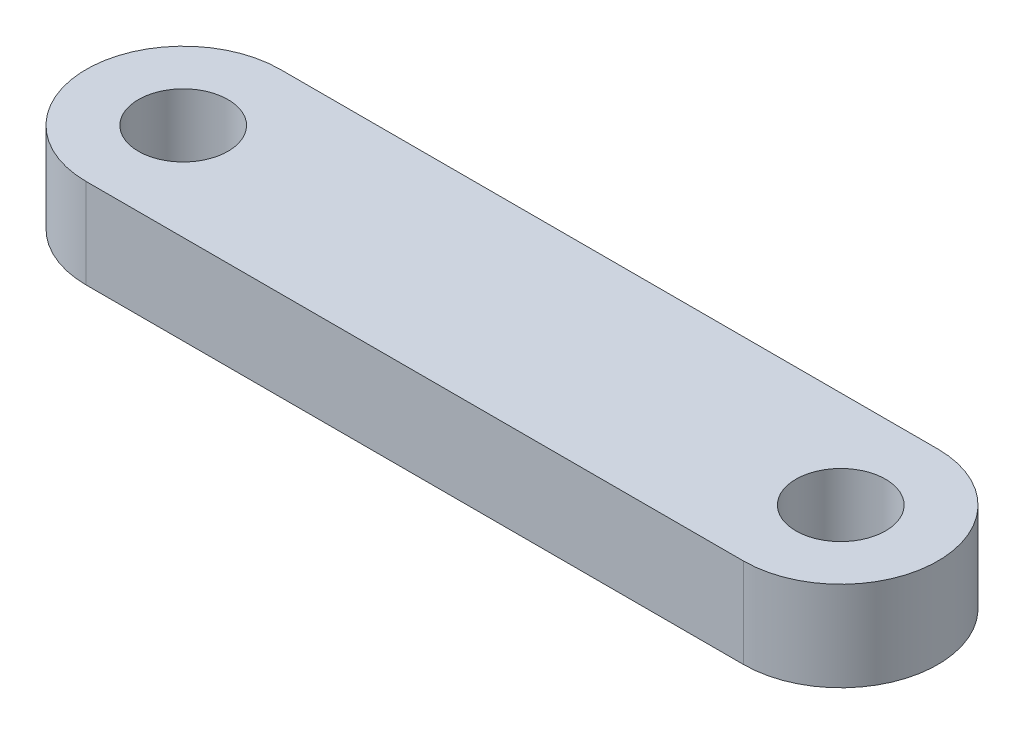
ISO-10303-21;
HEADER;
FILE_DESCRIPTION(('STEP AP214'),'2;1');
FILE_NAME('part.step','',(''),(''),'','','');
FILE_SCHEMA(('AUTOMOTIVE_DESIGN { 1 0 10303 214 1 1 1 1 }'));
ENDSEC;
DATA;
#1=APPLICATION_CONTEXT('core data for automotive mechanical design processes');
#2=APPLICATION_PROTOCOL_DEFINITION('international standard','automotive_design',2000,#1);
#3=PRODUCT_CONTEXT('',#1,'mechanical');
#4=PRODUCT('Part','Part','',(#3));
#5=PRODUCT_RELATED_PRODUCT_CATEGORY('part','',(#4));
#6=PRODUCT_DEFINITION_FORMATION('','',#4);
#7=PRODUCT_DEFINITION_CONTEXT('part definition',#1,'design');
#8=PRODUCT_DEFINITION('design','',#6,#7);
#9=PRODUCT_DEFINITION_SHAPE('','',#8);
#10=(LENGTH_UNIT() NAMED_UNIT(*) SI_UNIT(.MILLI.,.METRE.));
#11=(NAMED_UNIT(*) PLANE_ANGLE_UNIT() SI_UNIT($,.RADIAN.));
#12=(NAMED_UNIT(*) SI_UNIT($,.STERADIAN.) SOLID_ANGLE_UNIT());
#13=UNCERTAINTY_MEASURE_WITH_UNIT(LENGTH_MEASURE(1.E-05),#10,'distance_accuracy_value','');
#14=(GEOMETRIC_REPRESENTATION_CONTEXT(3) GLOBAL_UNCERTAINTY_ASSIGNED_CONTEXT((#13)) GLOBAL_UNIT_ASSIGNED_CONTEXT((#10,
#11,#12)) REPRESENTATION_CONTEXT('',''));
#15=CARTESIAN_POINT('',(0.,0.,0.));
#16=DIRECTION('',(0.,0.,1.));
#17=DIRECTION('',(1.,0.,0.));
#18=AXIS2_PLACEMENT_3D('',#15,#16,#17);
#19=CARTESIAN_POINT('',(-0.00681255714562196,3.,-136.973609565496));
#20=DIRECTION('',(4.97362751759736E-05,0.,0.999999998763151));
#21=DIRECTION('',(0.999999998763152,0.,-4.97362751759736E-05));
#22=AXIS2_PLACEMENT_3D('',#19,#20,#21);
#23=PLANE('',#22);
#24=DIRECTION('',(-0.999999998763152,0.,4.97362751759736E-05));
#25=VECTOR('',#24,1.);
#26=CARTESIAN_POINT('',(-0.00681255714562196,0.,-136.973609565496));
#27=LINE('',#26,#25);
#28=CARTESIAN_POINT('',(221.29931162483,0.,-136.984616507798));
#29=VERTEX_POINT('',#28);
#30=CARTESIAN_POINT('',(199.29931162483,0.,-136.983522309744));
#31=VERTEX_POINT('',#30);
#32=EDGE_CURVE('E105',#29,#31,#27,.T.);
#33=ORIENTED_EDGE('',*,*,#32,.T.);
#34=DIRECTION('',(0.,-1.,0.));
#35=VECTOR('',#34,1.);
#36=CARTESIAN_POINT('',(199.29931162483,3.,-136.983522309744));
#37=LINE('',#36,#35);
#38=CARTESIAN_POINT('',(199.29931162483,3.,-136.983522309744));
#39=VERTEX_POINT('',#38);
#40=EDGE_CURVE('E11',#39,#31,#37,.T.);
#41=ORIENTED_EDGE('',*,*,#40,.F.);
#42=DIRECTION('',(-0.999999998763152,0.,4.97362751759736E-05));
#43=VECTOR('',#42,1.);
#44=CARTESIAN_POINT('',(-0.00681255714562196,3.,-136.973609565496));
#45=LINE('',#44,#43);
#46=CARTESIAN_POINT('',(221.29931162483,3.,-136.984616507798));
#47=VERTEX_POINT('',#46);
#48=EDGE_CURVE('E87',#47,#39,#45,.T.);
#49=ORIENTED_EDGE('',*,*,#48,.F.);
#50=DIRECTION('',(0.,-1.,0.));
#51=VECTOR('',#50,1.);
#52=CARTESIAN_POINT('',(221.29931162483,3.,-136.984616507798));
#53=LINE('',#52,#51);
#54=EDGE_CURVE('E95',#47,#29,#53,.T.);
#55=ORIENTED_EDGE('',*,*,#54,.T.);
#56=EDGE_LOOP('',(#33,#41,#49,#55));
#57=FACE_BOUND('',#56,.T.);
#58=ADVANCED_FACE('F35',(#57),#23,.F.);
#59=CARTESIAN_POINT('',(199.29939413188,3.,-133.735744618646));
#60=DIRECTION('',(0.,-1.,0.));
#61=DIRECTION('',(0.,0.,-1.));
#62=AXIS2_PLACEMENT_3D('',#59,#60,#61);
#63=CYLINDRICAL_SURFACE('',#62,3.24777769214611);
#64=CARTESIAN_POINT('',(199.29939413188,0.,-133.735744618646));
#65=DIRECTION('',(0.,1.,0.));
#66=DIRECTION('',(0.,0.,1.));
#67=AXIS2_PLACEMENT_3D('',#64,#65,#66);
#68=CIRCLE('',#67,3.24777769214611);
#69=CARTESIAN_POINT('',(199.29931162483,0.,-130.487966927548));
#70=VERTEX_POINT('',#69);
#71=EDGE_CURVE('E91',#31,#70,#68,.T.);
#72=ORIENTED_EDGE('',*,*,#71,.T.);
#73=DIRECTION('',(0.,-1.,0.));
#74=VECTOR('',#73,1.);
#75=CARTESIAN_POINT('',(199.29931162483,3.,-130.487966927548));
#76=LINE('',#75,#74);
#77=CARTESIAN_POINT('',(199.29931162483,3.,-130.487966927548));
#78=VERTEX_POINT('',#77);
#79=EDGE_CURVE('E44',#78,#70,#76,.T.);
#80=ORIENTED_EDGE('',*,*,#79,.F.);
#81=CARTESIAN_POINT('',(199.29939413188,3.,-133.735744618646));
#82=DIRECTION('',(0.,1.,0.));
#83=DIRECTION('',(0.,0.,1.));
#84=AXIS2_PLACEMENT_3D('',#81,#82,#83);
#85=CIRCLE('',#84,3.24777769214611);
#86=EDGE_CURVE('E82',#39,#78,#85,.T.);
#87=ORIENTED_EDGE('',*,*,#86,.F.);
#88=ORIENTED_EDGE('',*,*,#40,.T.);
#89=EDGE_LOOP('',(#72,#80,#87,#88));
#90=FACE_BOUND('',#89,.T.);
#91=ADVANCED_FACE('F90',(#90),#63,.T.);
#92=CARTESIAN_POINT('',(-2.53661661056377E-12,3.,-130.487966927544));
#93=DIRECTION('',(0.,0.,-1.));
#94=DIRECTION('',(-1.,0.,0.));
#95=AXIS2_PLACEMENT_3D('',#92,#93,#94);
#96=PLANE('',#95);
#97=DIRECTION('',(1.,0.,0.));
#98=VECTOR('',#97,1.);
#99=CARTESIAN_POINT('',(-2.53661661056377E-12,0.,-130.487966927544));
#100=LINE('',#99,#98);
#101=CARTESIAN_POINT('',(221.29931162483,0.,-130.487966927548));
#102=VERTEX_POINT('',#101);
#103=EDGE_CURVE('E69',#70,#102,#100,.T.);
#104=ORIENTED_EDGE('',*,*,#103,.T.);
#105=DIRECTION('',(0.,-1.,0.));
#106=VECTOR('',#105,1.);
#107=CARTESIAN_POINT('',(221.29931162483,3.,-130.487966927548));
#108=LINE('',#107,#106);
#109=CARTESIAN_POINT('',(221.29931162483,3.,-130.487966927548));
#110=VERTEX_POINT('',#109);
#111=EDGE_CURVE('E92',#110,#102,#108,.T.);
#112=ORIENTED_EDGE('',*,*,#111,.F.);
#113=DIRECTION('',(1.,0.,0.));
#114=VECTOR('',#113,1.);
#115=CARTESIAN_POINT('',(-2.53661661056377E-12,3.,-130.487966927544));
#116=LINE('',#115,#114);
#117=EDGE_CURVE('E85',#78,#110,#116,.T.);
#118=ORIENTED_EDGE('',*,*,#117,.F.);
#119=ORIENTED_EDGE('',*,*,#79,.T.);
#120=EDGE_LOOP('',(#104,#112,#118,#119));
#121=FACE_BOUND('',#120,.T.);
#122=ADVANCED_FACE('F93',(#121),#96,.F.);
#123=CARTESIAN_POINT('',(199.29931162483,3.,-133.735744618646));
#124=DIRECTION('',(0.,-1.,0.));
#125=DIRECTION('',(0.,0.,-1.));
#126=AXIS2_PLACEMENT_3D('',#123,#124,#125);
#127=CYLINDRICAL_SURFACE('',#126,1.5);
#128=CARTESIAN_POINT('',(199.29931162483,3.,-133.735744618646));
#129=DIRECTION('',(0.,1.,0.));
#130=DIRECTION('',(0.,0.,1.));
#131=AXIS2_PLACEMENT_3D('',#128,#129,#130);
#132=CIRCLE('',#131,1.5);
#133=CARTESIAN_POINT('',(199.29931162483,3.,-132.235744618646));
#134=VERTEX_POINT('',#133);
#135=EDGE_CURVE('E118',#134,#134,#132,.T.);
#136=ORIENTED_EDGE('',*,*,#135,.T.);
#137=EDGE_LOOP('',(#136));
#138=FACE_BOUND('',#137,.T.);
#139=CARTESIAN_POINT('',(199.29931162483,0.,-133.735744618646));
#140=DIRECTION('',(0.,1.,0.));
#141=DIRECTION('',(0.,0.,1.));
#142=AXIS2_PLACEMENT_3D('',#139,#140,#141);
#143=CIRCLE('',#142,1.5);
#144=CARTESIAN_POINT('',(199.29931162483,0.,-132.235744618646));
#145=VERTEX_POINT('',#144);
#146=EDGE_CURVE('E102',#145,#145,#143,.T.);
#147=ORIENTED_EDGE('',*,*,#146,.F.);
#148=EDGE_LOOP('',(#147));
#149=FACE_BOUND('',#148,.T.);
#150=ADVANCED_FACE('F132',(#138,#149),#127,.F.);
#151=CARTESIAN_POINT('',(221.299311624831,3.,-133.735744618646));
#152=DIRECTION('',(0.,-1.,0.));
#153=DIRECTION('',(0.,0.,-1.));
#154=AXIS2_PLACEMENT_3D('',#151,#152,#153);
#155=CYLINDRICAL_SURFACE('',#154,1.5);
#156=CARTESIAN_POINT('',(221.299311624831,3.,-133.735744618646));
#157=DIRECTION('',(0.,1.,0.));
#158=DIRECTION('',(0.,0.,1.));
#159=AXIS2_PLACEMENT_3D('',#156,#157,#158);
#160=CIRCLE('',#159,1.5);
#161=CARTESIAN_POINT('',(221.299311624831,3.,-132.235744618646));
#162=VERTEX_POINT('',#161);
#163=EDGE_CURVE('E111',#162,#162,#160,.T.);
#164=ORIENTED_EDGE('',*,*,#163,.T.);
#165=EDGE_LOOP('',(#164));
#166=FACE_BOUND('',#165,.T.);
#167=CARTESIAN_POINT('',(221.299311624831,0.,-133.735744618646));
#168=DIRECTION('',(0.,1.,0.));
#169=DIRECTION('',(0.,0.,1.));
#170=AXIS2_PLACEMENT_3D('',#167,#168,#169);
#171=CIRCLE('',#170,1.5);
#172=CARTESIAN_POINT('',(221.299311624831,0.,-132.235744618646));
#173=VERTEX_POINT('',#172);
#174=EDGE_CURVE('E99',#173,#173,#171,.T.);
#175=ORIENTED_EDGE('',*,*,#174,.F.);
#176=EDGE_LOOP('',(#175));
#177=FACE_BOUND('',#176,.T.);
#178=ADVANCED_FACE('F37',(#166,#177),#155,.F.);
#179=CARTESIAN_POINT('',(221.299270364465,3.,-133.736291717673));
#180=DIRECTION('',(0.,-1.,0.));
#181=DIRECTION('',(0.,0.,-1.));
#182=AXIS2_PLACEMENT_3D('',#179,#180,#181);
#183=CYLINDRICAL_SURFACE('',#182,3.24832479038684);
#184=CARTESIAN_POINT('',(221.299270364465,0.,-133.736291717673));
#185=DIRECTION('',(0.,1.,0.));
#186=DIRECTION('',(0.,0.,1.));
#187=AXIS2_PLACEMENT_3D('',#184,#185,#186);
#188=CIRCLE('',#187,3.24832479038684);
#189=EDGE_CURVE('E75',#102,#29,#188,.T.);
#190=ORIENTED_EDGE('',*,*,#189,.T.);
#191=ORIENTED_EDGE('',*,*,#54,.F.);
#192=CARTESIAN_POINT('',(221.299270364465,3.,-133.736291717673));
#193=DIRECTION('',(0.,1.,0.));
#194=DIRECTION('',(0.,0.,1.));
#195=AXIS2_PLACEMENT_3D('',#192,#193,#194);
#196=CIRCLE('',#195,3.24832479038684);
#197=EDGE_CURVE('E52',#110,#47,#196,.T.);
#198=ORIENTED_EDGE('',*,*,#197,.F.);
#199=ORIENTED_EDGE('',*,*,#111,.T.);
#200=EDGE_LOOP('',(#190,#191,#198,#199));
#201=FACE_BOUND('',#200,.T.);
#202=ADVANCED_FACE('F113',(#201),#183,.T.);
#203=CARTESIAN_POINT('',(0.,3.,0.));
#204=DIRECTION('',(0.,1.,0.));
#205=DIRECTION('',(0.,0.,1.));
#206=AXIS2_PLACEMENT_3D('',#203,#204,#205);
#207=PLANE('',#206);
#208=ORIENTED_EDGE('',*,*,#163,.F.);
#209=EDGE_LOOP('',(#208));
#210=FACE_BOUND('',#209,.T.);
#211=ORIENTED_EDGE('',*,*,#135,.F.);
#212=EDGE_LOOP('',(#211));
#213=FACE_BOUND('',#212,.T.);
#214=ORIENTED_EDGE('',*,*,#48,.T.);
#215=ORIENTED_EDGE('',*,*,#86,.T.);
#216=ORIENTED_EDGE('',*,*,#117,.T.);
#217=ORIENTED_EDGE('',*,*,#197,.T.);
#218=EDGE_LOOP('',(#214,#215,#216,#217));
#219=FACE_BOUND('',#218,.T.);
#220=ADVANCED_FACE('F83',(#210,#213,#219),#207,.T.);
#221=CARTESIAN_POINT('',(0.,0.,0.));
#222=DIRECTION('',(0.,1.,0.));
#223=DIRECTION('',(0.,0.,1.));
#224=AXIS2_PLACEMENT_3D('',#221,#222,#223);
#225=PLANE('',#224);
#226=ORIENTED_EDGE('',*,*,#174,.T.);
#227=EDGE_LOOP('',(#226));
#228=FACE_BOUND('',#227,.T.);
#229=ORIENTED_EDGE('',*,*,#146,.T.);
#230=EDGE_LOOP('',(#229));
#231=FACE_BOUND('',#230,.T.);
#232=ORIENTED_EDGE('',*,*,#32,.F.);
#233=ORIENTED_EDGE('',*,*,#189,.F.);
#234=ORIENTED_EDGE('',*,*,#103,.F.);
#235=ORIENTED_EDGE('',*,*,#71,.F.);
#236=EDGE_LOOP('',(#232,#233,#234,#235));
#237=FACE_BOUND('',#236,.T.);
#238=ADVANCED_FACE('F116',(#228,#231,#237),#225,.F.);
#239=CLOSED_SHELL('',(#58,#91,#122,#150,#178,#202,#220,#238));
#240=MANIFOLD_SOLID_BREP('B2',#239);
#241=ADVANCED_BREP_SHAPE_REPRESENTATION('',(#18,#240),#14);
#242=SHAPE_DEFINITION_REPRESENTATION(#9,#241);
ENDSEC;
END-ISO-10303-21;
